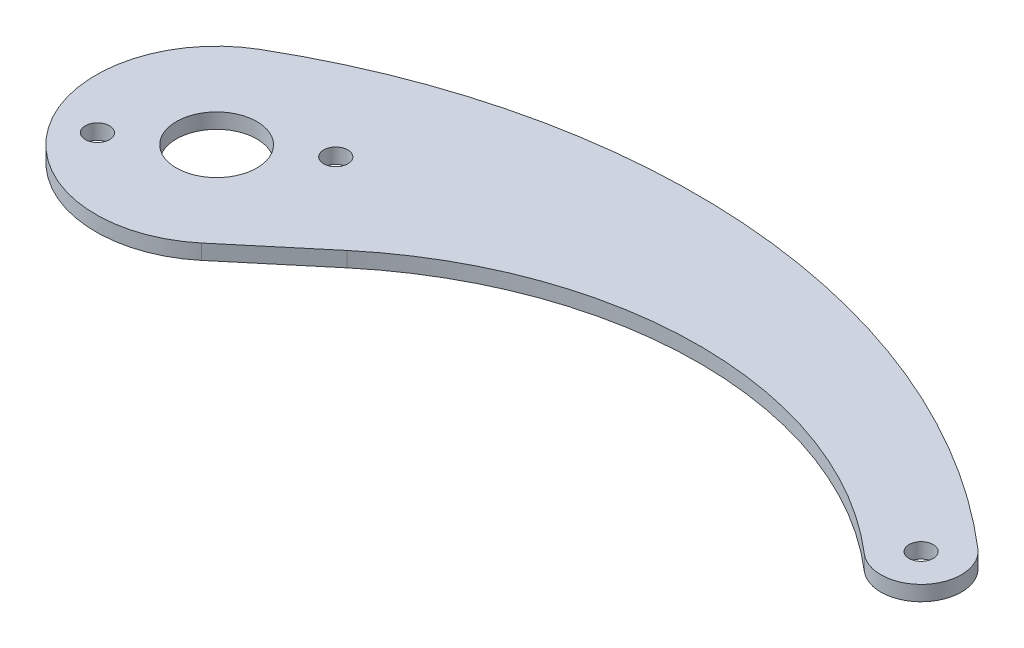
ISO-10303-21;
HEADER;
FILE_DESCRIPTION(('STEP AP214'),'2;1');
FILE_NAME('part.step','',(''),(''),'','','');
FILE_SCHEMA(('AUTOMOTIVE_DESIGN { 1 0 10303 214 1 1 1 1 }'));
ENDSEC;
DATA;
#1=APPLICATION_CONTEXT('core data for automotive mechanical design processes');
#2=APPLICATION_PROTOCOL_DEFINITION('international standard','automotive_design',2000,#1);
#3=PRODUCT_CONTEXT('',#1,'mechanical');
#4=PRODUCT('Part','Part','',(#3));
#5=PRODUCT_RELATED_PRODUCT_CATEGORY('part','',(#4));
#6=PRODUCT_DEFINITION_FORMATION('','',#4);
#7=PRODUCT_DEFINITION_CONTEXT('part definition',#1,'design');
#8=PRODUCT_DEFINITION('design','',#6,#7);
#9=PRODUCT_DEFINITION_SHAPE('','',#8);
#10=(LENGTH_UNIT() NAMED_UNIT(*) SI_UNIT(.MILLI.,.METRE.));
#11=(NAMED_UNIT(*) PLANE_ANGLE_UNIT() SI_UNIT($,.RADIAN.));
#12=(NAMED_UNIT(*) SI_UNIT($,.STERADIAN.) SOLID_ANGLE_UNIT());
#13=UNCERTAINTY_MEASURE_WITH_UNIT(LENGTH_MEASURE(1.E-05),#10,'distance_accuracy_value','');
#14=(GEOMETRIC_REPRESENTATION_CONTEXT(3) GLOBAL_UNCERTAINTY_ASSIGNED_CONTEXT((#13)) GLOBAL_UNIT_ASSIGNED_CONTEXT((#10,
#11,#12)) REPRESENTATION_CONTEXT('',''));
#15=CARTESIAN_POINT('',(0.,0.,0.));
#16=DIRECTION('',(0.,0.,1.));
#17=DIRECTION('',(1.,0.,0.));
#18=AXIS2_PLACEMENT_3D('',#15,#16,#17);
#19=CARTESIAN_POINT('',(0.,1.5,0.));
#20=DIRECTION('',(0.,1.,0.));
#21=DIRECTION('',(0.,0.,1.));
#22=AXIS2_PLACEMENT_3D('',#19,#20,#21);
#23=PLANE('',#22);
#24=CARTESIAN_POINT('',(6.9594972569598,1.5,-4.88010224589291));
#25=DIRECTION('',(0.,1.,0.));
#26=DIRECTION('',(0.,0.,1.));
#27=AXIS2_PLACEMENT_3D('',#24,#25,#26);
#28=CIRCLE('',#27,1.2);
#29=CARTESIAN_POINT('',(6.9594972569598,1.5,-3.68010224589291));
#30=VERTEX_POINT('',#29);
#31=EDGE_CURVE('E166',#30,#30,#28,.T.);
#32=ORIENTED_EDGE('',*,*,#31,.F.);
#33=EDGE_LOOP('',(#32));
#34=FACE_BOUND('',#33,.T.);
#35=CARTESIAN_POINT('',(-6.95949725695979,1.5,4.88010224589292));
#36=DIRECTION('',(0.,1.,0.));
#37=DIRECTION('',(0.,0.,1.));
#38=AXIS2_PLACEMENT_3D('',#35,#36,#37);
#39=CIRCLE('',#38,1.2);
#40=CARTESIAN_POINT('',(-6.95949725695979,1.5,6.08010224589292));
#41=VERTEX_POINT('',#40);
#42=EDGE_CURVE('E168',#41,#41,#39,.T.);
#43=ORIENTED_EDGE('',*,*,#42,.F.);
#44=EDGE_LOOP('',(#43));
#45=FACE_BOUND('',#44,.T.);
#46=CARTESIAN_POINT('',(0.,1.5,0.));
#47=DIRECTION('',(0.,1.,0.));
#48=DIRECTION('',(0.,0.,1.));
#49=AXIS2_PLACEMENT_3D('',#46,#47,#48);
#50=CIRCLE('',#49,4.);
#51=CARTESIAN_POINT('',(0.,1.5,4.));
#52=VERTEX_POINT('',#51);
#53=EDGE_CURVE('E112',#52,#52,#50,.T.);
#54=ORIENTED_EDGE('',*,*,#53,.F.);
#55=EDGE_LOOP('',(#54));
#56=FACE_BOUND('',#55,.T.);
#57=CARTESIAN_POINT('',(0.,1.5,0.));
#58=DIRECTION('',(0.,1.,0.));
#59=DIRECTION('',(0.,0.,1.));
#60=AXIS2_PLACEMENT_3D('',#57,#58,#59);
#61=CIRCLE('',#60,12.);
#62=CARTESIAN_POINT('',(-6.02615988951953,1.5,-10.3771574617496));
#63=VERTEX_POINT('',#62);
#64=CARTESIAN_POINT('',(7.70270927372979,1.5,9.20153627631806));
#65=VERTEX_POINT('',#64);
#66=EDGE_CURVE('E117',#63,#65,#61,.T.);
#67=ORIENTED_EDGE('',*,*,#66,.T.);
#68=DIRECTION('',(0.766794689693171,0.,-0.641892439477483));
#69=VECTOR('',#68,1.);
#70=CARTESIAN_POINT('',(7.70270927372979,1.5,9.20153627631806));
#71=LINE('',#70,#69);
#72=CARTESIAN_POINT('',(15.560016706615,1.5,2.62409605195058));
#73=VERTEX_POINT('',#72);
#74=EDGE_CURVE('E84',#65,#73,#71,.T.);
#75=ORIENTED_EDGE('',*,*,#74,.T.);
#76=CARTESIAN_POINT('',(41.2357142857143,1.5,33.2958836396774));
#77=DIRECTION('',(0.,-1.,0.));
#78=DIRECTION('',(0.,0.,1.));
#79=AXIS2_PLACEMENT_3D('',#76,#77,#78);
#80=CIRCLE('',#79,40.);
#81=CARTESIAN_POINT('',(67.3850649350649,1.5,3.02689851269794));
#82=VERTEX_POINT('',#81);
#83=EDGE_CURVE('E88',#73,#82,#80,.T.);
#84=ORIENTED_EDGE('',*,*,#83,.T.);
#85=CARTESIAN_POINT('',(70.,1.5,0.));
#86=DIRECTION('',(0.,1.,0.));
#87=DIRECTION('',(0.,0.,1.));
#88=AXIS2_PLACEMENT_3D('',#85,#86,#87);
#89=CIRCLE('',#88,4.);
#90=CARTESIAN_POINT('',(72.6149350649351,1.5,-3.02689851269795));
#91=VERTEX_POINT('',#90);
#92=EDGE_CURVE('E92',#82,#91,#89,.T.);
#93=ORIENTED_EDGE('',*,*,#92,.T.);
#94=CARTESIAN_POINT('',(28.1390052018399,1.5,48.4558812162158));
#95=DIRECTION('',(0.,1.,0.));
#96=DIRECTION('',(0.,0.,1.));
#97=AXIS2_PLACEMENT_3D('',#94,#95,#96);
#98=CIRCLE('',#97,68.0337044839013);
#99=EDGE_CURVE('E50',#91,#63,#98,.T.);
#100=ORIENTED_EDGE('',*,*,#99,.T.);
#101=EDGE_LOOP('',(#67,#75,#84,#93,#100));
#102=FACE_BOUND('',#101,.T.);
#103=CARTESIAN_POINT('',(70.,1.5,0.));
#104=DIRECTION('',(0.,1.,0.));
#105=DIRECTION('',(0.,0.,1.));
#106=AXIS2_PLACEMENT_3D('',#103,#104,#105);
#107=CIRCLE('',#106,1.2);
#108=CARTESIAN_POINT('',(70.,1.5,1.2));
#109=VERTEX_POINT('',#108);
#110=EDGE_CURVE('E177',#109,#109,#107,.T.);
#111=ORIENTED_EDGE('',*,*,#110,.F.);
#112=EDGE_LOOP('',(#111));
#113=FACE_BOUND('',#112,.T.);
#114=ADVANCED_FACE('F33',(#34,#45,#56,#102,#113),#23,.T.);
#115=CARTESIAN_POINT('',(0.,0.,0.));
#116=DIRECTION('',(0.,1.,0.));
#117=DIRECTION('',(0.,0.,1.));
#118=AXIS2_PLACEMENT_3D('',#115,#116,#117);
#119=PLANE('',#118);
#120=CARTESIAN_POINT('',(6.9594972569598,0.,-4.88010224589291));
#121=DIRECTION('',(0.,1.,0.));
#122=DIRECTION('',(0.,0.,1.));
#123=AXIS2_PLACEMENT_3D('',#120,#121,#122);
#124=CIRCLE('',#123,1.2);
#125=CARTESIAN_POINT('',(6.9594972569598,0.,-3.68010224589291));
#126=VERTEX_POINT('',#125);
#127=EDGE_CURVE('E164',#126,#126,#124,.T.);
#128=ORIENTED_EDGE('',*,*,#127,.T.);
#129=EDGE_LOOP('',(#128));
#130=FACE_BOUND('',#129,.T.);
#131=CARTESIAN_POINT('',(-6.95949725695979,0.,4.88010224589292));
#132=DIRECTION('',(0.,1.,0.));
#133=DIRECTION('',(0.,0.,1.));
#134=AXIS2_PLACEMENT_3D('',#131,#132,#133);
#135=CIRCLE('',#134,1.2);
#136=CARTESIAN_POINT('',(-6.95949725695979,0.,6.08010224589292));
#137=VERTEX_POINT('',#136);
#138=EDGE_CURVE('E171',#137,#137,#135,.T.);
#139=ORIENTED_EDGE('',*,*,#138,.T.);
#140=EDGE_LOOP('',(#139));
#141=FACE_BOUND('',#140,.T.);
#142=CARTESIAN_POINT('',(0.,0.,0.));
#143=DIRECTION('',(0.,1.,0.));
#144=DIRECTION('',(0.,0.,1.));
#145=AXIS2_PLACEMENT_3D('',#142,#143,#144);
#146=CIRCLE('',#145,4.);
#147=CARTESIAN_POINT('',(0.,0.,4.));
#148=VERTEX_POINT('',#147);
#149=EDGE_CURVE('E180',#148,#148,#146,.T.);
#150=ORIENTED_EDGE('',*,*,#149,.T.);
#151=EDGE_LOOP('',(#150));
#152=FACE_BOUND('',#151,.T.);
#153=CARTESIAN_POINT('',(0.,0.,0.));
#154=DIRECTION('',(0.,1.,0.));
#155=DIRECTION('',(0.,0.,1.));
#156=AXIS2_PLACEMENT_3D('',#153,#154,#155);
#157=CIRCLE('',#156,12.);
#158=CARTESIAN_POINT('',(-6.02615988951953,0.,-10.3771574617496));
#159=VERTEX_POINT('',#158);
#160=CARTESIAN_POINT('',(7.70270927372979,0.,9.20153627631806));
#161=VERTEX_POINT('',#160);
#162=EDGE_CURVE('E108',#159,#161,#157,.T.);
#163=ORIENTED_EDGE('',*,*,#162,.F.);
#164=CARTESIAN_POINT('',(28.1390052018399,0.,48.4558812162158));
#165=DIRECTION('',(0.,1.,0.));
#166=DIRECTION('',(0.,0.,1.));
#167=AXIS2_PLACEMENT_3D('',#164,#165,#166);
#168=CIRCLE('',#167,68.0337044839013);
#169=CARTESIAN_POINT('',(72.6149350649351,0.,-3.02689851269795));
#170=VERTEX_POINT('',#169);
#171=EDGE_CURVE('E76',#170,#159,#168,.T.);
#172=ORIENTED_EDGE('',*,*,#171,.F.);
#173=CARTESIAN_POINT('',(70.,0.,0.));
#174=DIRECTION('',(0.,1.,0.));
#175=DIRECTION('',(0.,0.,1.));
#176=AXIS2_PLACEMENT_3D('',#173,#174,#175);
#177=CIRCLE('',#176,4.);
#178=CARTESIAN_POINT('',(67.3850649350649,0.,3.02689851269794));
#179=VERTEX_POINT('',#178);
#180=EDGE_CURVE('E70',#179,#170,#177,.T.);
#181=ORIENTED_EDGE('',*,*,#180,.F.);
#182=CARTESIAN_POINT('',(41.2357142857143,0.,33.2958836396774));
#183=DIRECTION('',(0.,-1.,0.));
#184=DIRECTION('',(0.,0.,1.));
#185=AXIS2_PLACEMENT_3D('',#182,#183,#184);
#186=CIRCLE('',#185,40.);
#187=CARTESIAN_POINT('',(15.560016706615,0.,2.62409605195058));
#188=VERTEX_POINT('',#187);
#189=EDGE_CURVE('E99',#188,#179,#186,.T.);
#190=ORIENTED_EDGE('',*,*,#189,.F.);
#191=DIRECTION('',(0.766794689693171,0.,-0.641892439477483));
#192=VECTOR('',#191,1.);
#193=CARTESIAN_POINT('',(7.70270927372979,0.,9.20153627631806));
#194=LINE('',#193,#192);
#195=EDGE_CURVE('E111',#161,#188,#194,.T.);
#196=ORIENTED_EDGE('',*,*,#195,.F.);
#197=EDGE_LOOP('',(#163,#172,#181,#190,#196));
#198=FACE_BOUND('',#197,.T.);
#199=CARTESIAN_POINT('',(70.,0.,0.));
#200=DIRECTION('',(0.,1.,0.));
#201=DIRECTION('',(0.,0.,1.));
#202=AXIS2_PLACEMENT_3D('',#199,#200,#201);
#203=CIRCLE('',#202,1.2);
#204=CARTESIAN_POINT('',(70.,0.,1.2));
#205=VERTEX_POINT('',#204);
#206=EDGE_CURVE('E174',#205,#205,#203,.T.);
#207=ORIENTED_EDGE('',*,*,#206,.T.);
#208=EDGE_LOOP('',(#207));
#209=FACE_BOUND('',#208,.T.);
#210=ADVANCED_FACE('F121',(#130,#141,#152,#198,#209),#119,.F.);
#211=CARTESIAN_POINT('',(0.,1.5,0.));
#212=DIRECTION('',(0.,-1.,0.));
#213=DIRECTION('',(0.,0.,-1.));
#214=AXIS2_PLACEMENT_3D('',#211,#212,#213);
#215=CYLINDRICAL_SURFACE('',#214,12.);
#216=ORIENTED_EDGE('',*,*,#162,.T.);
#217=DIRECTION('',(0.,-1.,0.));
#218=VECTOR('',#217,1.);
#219=CARTESIAN_POINT('',(7.70270927372979,1.5,9.20153627631806));
#220=LINE('',#219,#218);
#221=EDGE_CURVE('E11',#65,#161,#220,.T.);
#222=ORIENTED_EDGE('',*,*,#221,.F.);
#223=ORIENTED_EDGE('',*,*,#66,.F.);
#224=DIRECTION('',(0.,-1.,0.));
#225=VECTOR('',#224,1.);
#226=CARTESIAN_POINT('',(-6.02615988951953,1.5,-10.3771574617496));
#227=LINE('',#226,#225);
#228=EDGE_CURVE('E104',#63,#159,#227,.T.);
#229=ORIENTED_EDGE('',*,*,#228,.T.);
#230=EDGE_LOOP('',(#216,#222,#223,#229));
#231=FACE_BOUND('',#230,.T.);
#232=ADVANCED_FACE('F35',(#231),#215,.T.);
#233=CARTESIAN_POINT('',(7.70270927372979,1.5,9.20153627631806));
#234=DIRECTION('',(-0.641892439477483,0.,-0.766794689693171));
#235=DIRECTION('',(-0.766794689693171,0.,0.641892439477483));
#236=AXIS2_PLACEMENT_3D('',#233,#234,#235);
#237=PLANE('',#236);
#238=ORIENTED_EDGE('',*,*,#195,.T.);
#239=DIRECTION('',(0.,-1.,0.));
#240=VECTOR('',#239,1.);
#241=CARTESIAN_POINT('',(15.560016706615,1.5,2.62409605195058));
#242=LINE('',#241,#240);
#243=EDGE_CURVE('E42',#73,#188,#242,.T.);
#244=ORIENTED_EDGE('',*,*,#243,.F.);
#245=ORIENTED_EDGE('',*,*,#74,.F.);
#246=ORIENTED_EDGE('',*,*,#221,.T.);
#247=EDGE_LOOP('',(#238,#244,#245,#246));
#248=FACE_BOUND('',#247,.T.);
#249=ADVANCED_FACE('F231',(#248),#237,.F.);
#250=CARTESIAN_POINT('',(41.2357142857143,1.5,33.2958836396774));
#251=DIRECTION('',(0.,-1.,0.));
#252=DIRECTION('',(0.,0.,-1.));
#253=AXIS2_PLACEMENT_3D('',#250,#251,#252);
#254=CYLINDRICAL_SURFACE('',#253,40.);
#255=ORIENTED_EDGE('',*,*,#189,.T.);
#256=DIRECTION('',(0.,-1.,0.));
#257=VECTOR('',#256,1.);
#258=CARTESIAN_POINT('',(67.3850649350649,1.5,3.02689851269794));
#259=LINE('',#258,#257);
#260=EDGE_CURVE('E96',#82,#179,#259,.T.);
#261=ORIENTED_EDGE('',*,*,#260,.F.);
#262=ORIENTED_EDGE('',*,*,#83,.F.);
#263=ORIENTED_EDGE('',*,*,#243,.T.);
#264=EDGE_LOOP('',(#255,#261,#262,#263));
#265=FACE_BOUND('',#264,.T.);
#266=ADVANCED_FACE('F97',(#265),#254,.F.);
#267=CARTESIAN_POINT('',(70.,1.5,0.));
#268=DIRECTION('',(0.,-1.,0.));
#269=DIRECTION('',(0.,0.,-1.));
#270=AXIS2_PLACEMENT_3D('',#267,#268,#269);
#271=CYLINDRICAL_SURFACE('',#270,4.);
#272=ORIENTED_EDGE('',*,*,#180,.T.);
#273=DIRECTION('',(0.,-1.,0.));
#274=VECTOR('',#273,1.);
#275=CARTESIAN_POINT('',(72.6149350649351,1.5,-3.02689851269795));
#276=LINE('',#275,#274);
#277=EDGE_CURVE('E100',#91,#170,#276,.T.);
#278=ORIENTED_EDGE('',*,*,#277,.F.);
#279=ORIENTED_EDGE('',*,*,#92,.F.);
#280=ORIENTED_EDGE('',*,*,#260,.T.);
#281=EDGE_LOOP('',(#272,#278,#279,#280));
#282=FACE_BOUND('',#281,.T.);
#283=ADVANCED_FACE('F102',(#282),#271,.T.);
#284=CARTESIAN_POINT('',(28.1390052018399,1.5,48.4558812162158));
#285=DIRECTION('',(0.,-1.,0.));
#286=DIRECTION('',(0.,0.,-1.));
#287=AXIS2_PLACEMENT_3D('',#284,#285,#286);
#288=CYLINDRICAL_SURFACE('',#287,68.0337044839013);
#289=ORIENTED_EDGE('',*,*,#171,.T.);
#290=ORIENTED_EDGE('',*,*,#228,.F.);
#291=ORIENTED_EDGE('',*,*,#99,.F.);
#292=ORIENTED_EDGE('',*,*,#277,.T.);
#293=EDGE_LOOP('',(#289,#290,#291,#292));
#294=FACE_BOUND('',#293,.T.);
#295=ADVANCED_FACE('F126',(#294),#288,.T.);
#296=CARTESIAN_POINT('',(0.,1.5,0.));
#297=DIRECTION('',(0.,-1.,0.));
#298=DIRECTION('',(0.,0.,-1.));
#299=AXIS2_PLACEMENT_3D('',#296,#297,#298);
#300=CYLINDRICAL_SURFACE('',#299,4.);
#301=ORIENTED_EDGE('',*,*,#53,.T.);
#302=EDGE_LOOP('',(#301));
#303=FACE_BOUND('',#302,.T.);
#304=ORIENTED_EDGE('',*,*,#149,.F.);
#305=EDGE_LOOP('',(#304));
#306=FACE_BOUND('',#305,.T.);
#307=ADVANCED_FACE('F128',(#303,#306),#300,.F.);
#308=CARTESIAN_POINT('',(70.,1.5,0.));
#309=DIRECTION('',(0.,-1.,0.));
#310=DIRECTION('',(0.,0.,-1.));
#311=AXIS2_PLACEMENT_3D('',#308,#309,#310);
#312=CYLINDRICAL_SURFACE('',#311,1.2);
#313=ORIENTED_EDGE('',*,*,#110,.T.);
#314=EDGE_LOOP('',(#313));
#315=FACE_BOUND('',#314,.T.);
#316=ORIENTED_EDGE('',*,*,#206,.F.);
#317=EDGE_LOOP('',(#316));
#318=FACE_BOUND('',#317,.T.);
#319=ADVANCED_FACE('F134',(#315,#318),#312,.F.);
#320=CARTESIAN_POINT('',(-6.95949725695979,0.,4.88010224589292));
#321=DIRECTION('',(0.,1.,0.));
#322=DIRECTION('',(0.,0.,1.));
#323=AXIS2_PLACEMENT_3D('',#320,#321,#322);
#324=CYLINDRICAL_SURFACE('',#323,1.2);
#325=ORIENTED_EDGE('',*,*,#138,.F.);
#326=EDGE_LOOP('',(#325));
#327=FACE_BOUND('',#326,.T.);
#328=ORIENTED_EDGE('',*,*,#42,.T.);
#329=EDGE_LOOP('',(#328));
#330=FACE_BOUND('',#329,.T.);
#331=ADVANCED_FACE('F151',(#327,#330),#324,.F.);
#332=CARTESIAN_POINT('',(6.9594972569598,0.,-4.88010224589291));
#333=DIRECTION('',(0.,1.,0.));
#334=DIRECTION('',(0.,0.,1.));
#335=AXIS2_PLACEMENT_3D('',#332,#333,#334);
#336=CYLINDRICAL_SURFACE('',#335,1.2);
#337=ORIENTED_EDGE('',*,*,#127,.F.);
#338=EDGE_LOOP('',(#337));
#339=FACE_BOUND('',#338,.T.);
#340=ORIENTED_EDGE('',*,*,#31,.T.);
#341=EDGE_LOOP('',(#340));
#342=FACE_BOUND('',#341,.T.);
#343=ADVANCED_FACE('F155',(#339,#342),#336,.F.);
#344=CLOSED_SHELL('',(#114,#210,#232,#249,#266,#283,#295,#307,#319,#331,#343));
#345=MANIFOLD_SOLID_BREP('B2',#344);
#346=ADVANCED_BREP_SHAPE_REPRESENTATION('',(#18,#345),#14);
#347=SHAPE_DEFINITION_REPRESENTATION(#9,#346);
ENDSEC;
END-ISO-10303-21;
